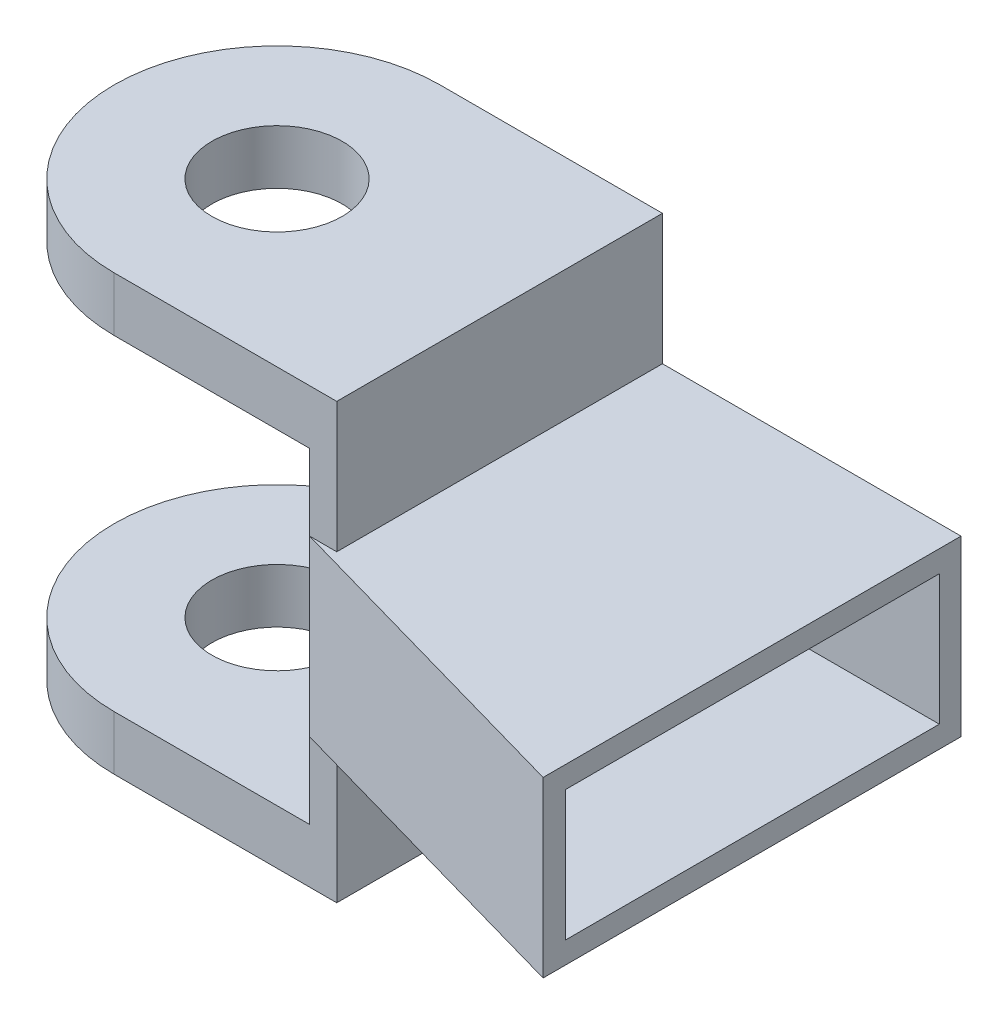
ISO-10303-21;
HEADER;
FILE_DESCRIPTION(('STEP AP214'),'2;1');
FILE_NAME('part.step','',(''),(''),'','','');
FILE_SCHEMA(('AUTOMOTIVE_DESIGN { 1 0 10303 214 1 1 1 1 }'));
ENDSEC;
DATA;
#1=APPLICATION_CONTEXT('core data for automotive mechanical design processes');
#2=APPLICATION_PROTOCOL_DEFINITION('international standard','automotive_design',2000,#1);
#3=PRODUCT_CONTEXT('',#1,'mechanical');
#4=PRODUCT('Part','Part','',(#3));
#5=PRODUCT_RELATED_PRODUCT_CATEGORY('part','',(#4));
#6=PRODUCT_DEFINITION_FORMATION('','',#4);
#7=PRODUCT_DEFINITION_CONTEXT('part definition',#1,'design');
#8=PRODUCT_DEFINITION('design','',#6,#7);
#9=PRODUCT_DEFINITION_SHAPE('','',#8);
#10=(LENGTH_UNIT() NAMED_UNIT(*) SI_UNIT(.MILLI.,.METRE.));
#11=(NAMED_UNIT(*) PLANE_ANGLE_UNIT() SI_UNIT($,.RADIAN.));
#12=(NAMED_UNIT(*) SI_UNIT($,.STERADIAN.) SOLID_ANGLE_UNIT());
#13=UNCERTAINTY_MEASURE_WITH_UNIT(LENGTH_MEASURE(1.E-05),#10,'distance_accuracy_value','');
#14=(GEOMETRIC_REPRESENTATION_CONTEXT(3) GLOBAL_UNCERTAINTY_ASSIGNED_CONTEXT((#13)) GLOBAL_UNIT_ASSIGNED_CONTEXT((#10,
#11,#12)) REPRESENTATION_CONTEXT('',''));
#15=CARTESIAN_POINT('',(0.,0.,0.));
#16=DIRECTION('',(0.,0.,1.));
#17=DIRECTION('',(1.,0.,0.));
#18=AXIS2_PLACEMENT_3D('',#15,#16,#17);
#19=CARTESIAN_POINT('',(-350.,16.,-31.0082296544966));
#20=DIRECTION('',(1.,0.,0.));
#21=DIRECTION('',(0.,0.,-1.));
#22=AXIS2_PLACEMENT_3D('',#19,#20,#21);
#23=PLANE('',#22);
#24=DIRECTION('',(0.,0.,-1.));
#25=VECTOR('',#24,1.);
#26=CARTESIAN_POINT('',(-350.,-7.,0.));
#27=LINE('',#26,#25);
#28=CARTESIAN_POINT('',(-350.,-7.,-31.0082296544966));
#29=VERTEX_POINT('',#28);
#30=CARTESIAN_POINT('',(-350.,-7.,-61.0082296544966));
#31=VERTEX_POINT('',#30);
#32=EDGE_CURVE('E170',#29,#31,#27,.T.);
#33=ORIENTED_EDGE('',*,*,#32,.F.);
#34=DIRECTION('',(0.,-1.,0.));
#35=VECTOR('',#34,1.);
#36=CARTESIAN_POINT('',(-350.,-12.,-31.0082296544966));
#37=LINE('',#36,#35);
#38=CARTESIAN_POINT('',(-350.,0.,-31.0082296544966));
#39=VERTEX_POINT('',#38);
#40=EDGE_CURVE('E184',#39,#29,#37,.T.);
#41=ORIENTED_EDGE('',*,*,#40,.F.);
#42=DIRECTION('',(0.,-1.,0.));
#43=VECTOR('',#42,1.);
#44=CARTESIAN_POINT('',(-350.,16.,-31.0082296544966));
#45=LINE('',#44,#43);
#46=CARTESIAN_POINT('',(-350.,16.,-31.0082296544966));
#47=VERTEX_POINT('',#46);
#48=EDGE_CURVE('E11',#47,#39,#45,.T.);
#49=ORIENTED_EDGE('',*,*,#48,.F.);
#50=DIRECTION('',(0.,1.,0.));
#51=VECTOR('',#50,1.);
#52=CARTESIAN_POINT('',(-350.,28.,-31.0082296544966));
#53=LINE('',#52,#51);
#54=CARTESIAN_POINT('',(-350.,23.,-31.0082296544966));
#55=VERTEX_POINT('',#54);
#56=EDGE_CURVE('E234',#47,#55,#53,.T.);
#57=ORIENTED_EDGE('',*,*,#56,.T.);
#58=DIRECTION('',(0.,0.,-1.));
#59=VECTOR('',#58,1.);
#60=CARTESIAN_POINT('',(-350.,23.,-61.0082296544966));
#61=LINE('',#60,#59);
#62=CARTESIAN_POINT('',(-350.,23.,-61.0082296544966));
#63=VERTEX_POINT('',#62);
#64=EDGE_CURVE('E216',#55,#63,#61,.T.);
#65=ORIENTED_EDGE('',*,*,#64,.T.);
#66=DIRECTION('',(0.,-1.,0.));
#67=VECTOR('',#66,1.);
#68=CARTESIAN_POINT('',(-350.,16.,-61.0082296544966));
#69=LINE('',#68,#67);
#70=EDGE_CURVE('E297',#63,#31,#69,.T.);
#71=ORIENTED_EDGE('',*,*,#70,.T.);
#72=EDGE_LOOP('',(#33,#41,#49,#57,#65,#71));
#73=FACE_BOUND('',#72,.T.);
#74=ADVANCED_FACE('F38',(#73),#23,.F.);
#75=CARTESIAN_POINT('',(-320.,16.,-61.0082296544966));
#76=DIRECTION('',(-1.,0.,0.));
#77=DIRECTION('',(0.,0.,1.));
#78=AXIS2_PLACEMENT_3D('',#75,#76,#77);
#79=PLANE('',#78);
#80=DIRECTION('',(0.,0.,-1.));
#81=VECTOR('',#80,1.);
#82=CARTESIAN_POINT('',(-320.,0.,-61.0082296544966));
#83=LINE('',#82,#81);
#84=CARTESIAN_POINT('',(-320.,0.,-22.5144026413586));
#85=VERTEX_POINT('',#84);
#86=CARTESIAN_POINT('',(-320.,0.,-61.0082296544966));
#87=VERTEX_POINT('',#86);
#88=EDGE_CURVE('E299',#85,#87,#83,.T.);
#89=ORIENTED_EDGE('',*,*,#88,.T.);
#90=DIRECTION('',(0.,-1.,0.));
#91=VECTOR('',#90,1.);
#92=CARTESIAN_POINT('',(-320.,16.,-61.0082296544966));
#93=LINE('',#92,#91);
#94=CARTESIAN_POINT('',(-320.,16.,-61.0082296544966));
#95=VERTEX_POINT('',#94);
#96=EDGE_CURVE('E304',#95,#87,#93,.T.);
#97=ORIENTED_EDGE('',*,*,#96,.F.);
#98=DIRECTION('',(0.,0.,-1.));
#99=VECTOR('',#98,1.);
#100=CARTESIAN_POINT('',(-320.,16.,-61.0082296544966));
#101=LINE('',#100,#99);
#102=CARTESIAN_POINT('',(-320.,16.,-22.5144026413586));
#103=VERTEX_POINT('',#102);
#104=EDGE_CURVE('E291',#103,#95,#101,.T.);
#105=ORIENTED_EDGE('',*,*,#104,.F.);
#106=DIRECTION('',(0.,-1.,0.));
#107=VECTOR('',#106,1.);
#108=CARTESIAN_POINT('',(-320.,16.,-22.5144026413586));
#109=LINE('',#108,#107);
#110=EDGE_CURVE('E45',#103,#85,#109,.T.);
#111=ORIENTED_EDGE('',*,*,#110,.T.);
#112=EDGE_LOOP('',(#89,#97,#105,#111));
#113=FACE_BOUND('',#112,.T.);
#114=DIRECTION('',(0.,0.,-1.));
#115=VECTOR('',#114,1.);
#116=CARTESIAN_POINT('',(-320.,2.,0.));
#117=LINE('',#116,#115);
#118=CARTESIAN_POINT('',(-320.,2.,-24.5930187379522));
#119=VERTEX_POINT('',#118);
#120=CARTESIAN_POINT('',(-320.,2.,-59.0082296544966));
#121=VERTEX_POINT('',#120);
#122=EDGE_CURVE('E276',#119,#121,#117,.T.);
#123=ORIENTED_EDGE('',*,*,#122,.F.);
#124=DIRECTION('',(0.,-1.,0.));
#125=VECTOR('',#124,1.);
#126=CARTESIAN_POINT('',(-320.,16.,-24.5930187379522));
#127=LINE('',#126,#125);
#128=CARTESIAN_POINT('',(-320.,14.,-24.5930187379522));
#129=VERTEX_POINT('',#128);
#130=EDGE_CURVE('E264',#129,#119,#127,.T.);
#131=ORIENTED_EDGE('',*,*,#130,.F.);
#132=DIRECTION('',(0.,0.,-1.));
#133=VECTOR('',#132,1.);
#134=CARTESIAN_POINT('',(-320.,14.,0.));
#135=LINE('',#134,#133);
#136=CARTESIAN_POINT('',(-320.,14.,-59.0082296544966));
#137=VERTEX_POINT('',#136);
#138=EDGE_CURVE('E279',#129,#137,#135,.T.);
#139=ORIENTED_EDGE('',*,*,#138,.T.);
#140=DIRECTION('',(0.,-1.,0.));
#141=VECTOR('',#140,1.);
#142=CARTESIAN_POINT('',(-320.,16.,-59.0082296544966));
#143=LINE('',#142,#141);
#144=EDGE_CURVE('E273',#137,#121,#143,.T.);
#145=ORIENTED_EDGE('',*,*,#144,.T.);
#146=EDGE_LOOP('',(#123,#131,#139,#145));
#147=FACE_BOUND('',#146,.T.);
#148=ADVANCED_FACE('F311',(#113,#147),#79,.F.);
#149=CARTESIAN_POINT('',(-350.,16.,-31.0082296544966));
#150=DIRECTION('',(0.272419296250593,0.,-0.962178635717054));
#151=DIRECTION('',(-0.962178635717054,0.,-0.272419296250593));
#152=AXIS2_PLACEMENT_3D('',#149,#150,#151);
#153=PLANE('',#152);
#154=DIRECTION('',(0.962178635717054,0.,0.272419296250593));
#155=VECTOR('',#154,1.);
#156=CARTESIAN_POINT('',(-350.,0.,-31.0082296544966));
#157=LINE('',#156,#155);
#158=EDGE_CURVE('E263',#39,#85,#157,.T.);
#159=ORIENTED_EDGE('',*,*,#158,.T.);
#160=ORIENTED_EDGE('',*,*,#110,.F.);
#161=DIRECTION('',(0.962178635717054,0.,0.272419296250593));
#162=VECTOR('',#161,1.);
#163=CARTESIAN_POINT('',(-350.,16.,-31.0082296544966));
#164=LINE('',#163,#162);
#165=EDGE_CURVE('E289',#47,#103,#164,.T.);
#166=ORIENTED_EDGE('',*,*,#165,.F.);
#167=ORIENTED_EDGE('',*,*,#48,.T.);
#168=EDGE_LOOP('',(#159,#160,#166,#167));
#169=FACE_BOUND('',#168,.T.);
#170=ADVANCED_FACE('F352',(#169),#153,.F.);
#171=CARTESIAN_POINT('',(-350.,16.,-61.0082296544966));
#172=DIRECTION('',(0.,0.,1.));
#173=DIRECTION('',(1.,0.,0.));
#174=AXIS2_PLACEMENT_3D('',#171,#172,#173);
#175=PLANE('',#174);
#176=DIRECTION('',(-1.,0.,0.));
#177=VECTOR('',#176,1.);
#178=CARTESIAN_POINT('',(-350.,0.,-61.0082296544966));
#179=LINE('',#178,#177);
#180=CARTESIAN_POINT('',(-347.5,0.,-61.0082296544966));
#181=VERTEX_POINT('',#180);
#182=EDGE_CURVE('E292',#87,#181,#179,.T.);
#183=ORIENTED_EDGE('',*,*,#182,.T.);
#184=DIRECTION('',(0.,1.,0.));
#185=VECTOR('',#184,1.);
#186=CARTESIAN_POINT('',(-347.5,0.,-61.0082296544966));
#187=LINE('',#186,#185);
#188=CARTESIAN_POINT('',(-347.5,-12.,-61.0082296544966));
#189=VERTEX_POINT('',#188);
#190=EDGE_CURVE('E198',#189,#181,#187,.T.);
#191=ORIENTED_EDGE('',*,*,#190,.F.);
#192=DIRECTION('',(-1.,0.,0.));
#193=VECTOR('',#192,1.);
#194=CARTESIAN_POINT('',(-347.5,-12.,-61.0082296544966));
#195=LINE('',#194,#193);
#196=CARTESIAN_POINT('',(-368.,-12.,-61.0082296544966));
#197=VERTEX_POINT('',#196);
#198=EDGE_CURVE('E205',#189,#197,#195,.T.);
#199=ORIENTED_EDGE('',*,*,#198,.T.);
#200=DIRECTION('',(0.,-1.,0.));
#201=VECTOR('',#200,1.);
#202=CARTESIAN_POINT('',(-368.,-7.,-61.0082296544966));
#203=LINE('',#202,#201);
#204=CARTESIAN_POINT('',(-368.,-7.,-61.0082296544966));
#205=VERTEX_POINT('',#204);
#206=EDGE_CURVE('E169',#205,#197,#203,.T.);
#207=ORIENTED_EDGE('',*,*,#206,.F.);
#208=DIRECTION('',(-1.,0.,0.));
#209=VECTOR('',#208,1.);
#210=CARTESIAN_POINT('',(0.,-7.,-61.0082296544966));
#211=LINE('',#210,#209);
#212=EDGE_CURVE('E177',#31,#205,#211,.T.);
#213=ORIENTED_EDGE('',*,*,#212,.F.);
#214=ORIENTED_EDGE('',*,*,#70,.F.);
#215=DIRECTION('',(-1.,0.,0.));
#216=VECTOR('',#215,1.);
#217=CARTESIAN_POINT('',(-350.,23.,-61.0082296544966));
#218=LINE('',#217,#216);
#219=CARTESIAN_POINT('',(-368.,23.,-61.0082296544966));
#220=VERTEX_POINT('',#219);
#221=EDGE_CURVE('E60',#63,#220,#218,.T.);
#222=ORIENTED_EDGE('',*,*,#221,.T.);
#223=DIRECTION('',(0.,-1.,0.));
#224=VECTOR('',#223,1.);
#225=CARTESIAN_POINT('',(-368.,28.,-61.0082296544966));
#226=LINE('',#225,#224);
#227=CARTESIAN_POINT('',(-368.,28.,-61.0082296544966));
#228=VERTEX_POINT('',#227);
#229=EDGE_CURVE('E231',#228,#220,#226,.T.);
#230=ORIENTED_EDGE('',*,*,#229,.F.);
#231=DIRECTION('',(-1.,0.,0.));
#232=VECTOR('',#231,1.);
#233=CARTESIAN_POINT('',(-347.5,28.,-61.0082296544966));
#234=LINE('',#233,#232);
#235=CARTESIAN_POINT('',(-347.5,28.,-61.0082296544966));
#236=VERTEX_POINT('',#235);
#237=EDGE_CURVE('E250',#236,#228,#234,.T.);
#238=ORIENTED_EDGE('',*,*,#237,.F.);
#239=DIRECTION('',(0.,-1.,0.));
#240=VECTOR('',#239,1.);
#241=CARTESIAN_POINT('',(-347.5,16.,-61.0082296544966));
#242=LINE('',#241,#240);
#243=CARTESIAN_POINT('',(-347.5,16.,-61.0082296544966));
#244=VERTEX_POINT('',#243);
#245=EDGE_CURVE('E244',#236,#244,#242,.T.);
#246=ORIENTED_EDGE('',*,*,#245,.T.);
#247=DIRECTION('',(-1.,0.,0.));
#248=VECTOR('',#247,1.);
#249=CARTESIAN_POINT('',(-350.,16.,-61.0082296544966));
#250=LINE('',#249,#248);
#251=EDGE_CURVE('E294',#95,#244,#250,.T.);
#252=ORIENTED_EDGE('',*,*,#251,.F.);
#253=ORIENTED_EDGE('',*,*,#96,.T.);
#254=EDGE_LOOP('',(#183,#191,#199,#207,#213,#214,#222,#230,#238,#246,#252,#253));
#255=FACE_BOUND('',#254,.T.);
#256=ADVANCED_FACE('F319',(#255),#175,.F.);
#257=CARTESIAN_POINT('',(0.,16.,0.));
#258=DIRECTION('',(0.,-1.,0.));
#259=DIRECTION('',(0.,0.,-1.));
#260=AXIS2_PLACEMENT_3D('',#257,#258,#259);
#261=PLANE('',#260);
#262=ORIENTED_EDGE('',*,*,#251,.T.);
#263=DIRECTION('',(0.,0.,1.));
#264=VECTOR('',#263,1.);
#265=CARTESIAN_POINT('',(-347.5,16.,-31.0082296544966));
#266=LINE('',#265,#264);
#267=CARTESIAN_POINT('',(-347.5,16.,-31.0082296544966));
#268=VERTEX_POINT('',#267);
#269=EDGE_CURVE('E235',#244,#268,#266,.T.);
#270=ORIENTED_EDGE('',*,*,#269,.T.);
#271=DIRECTION('',(-1.,0.,0.));
#272=VECTOR('',#271,1.);
#273=CARTESIAN_POINT('',(-347.5,16.,-31.0082296544966));
#274=LINE('',#273,#272);
#275=EDGE_CURVE('E247',#268,#47,#274,.T.);
#276=ORIENTED_EDGE('',*,*,#275,.T.);
#277=ORIENTED_EDGE('',*,*,#165,.T.);
#278=ORIENTED_EDGE('',*,*,#104,.T.);
#279=EDGE_LOOP('',(#262,#270,#276,#277,#278));
#280=FACE_BOUND('',#279,.T.);
#281=ADVANCED_FACE('F351',(#280),#261,.F.);
#282=CARTESIAN_POINT('',(0.,0.,0.));
#283=DIRECTION('',(0.,-1.,0.));
#284=DIRECTION('',(0.,0.,-1.));
#285=AXIS2_PLACEMENT_3D('',#282,#283,#284);
#286=PLANE('',#285);
#287=DIRECTION('',(-1.,0.,0.));
#288=VECTOR('',#287,1.);
#289=CARTESIAN_POINT('',(-347.5,0.,-31.0082296544966));
#290=LINE('',#289,#288);
#291=CARTESIAN_POINT('',(-347.5,0.,-31.0082296544966));
#292=VERTEX_POINT('',#291);
#293=EDGE_CURVE('E207',#292,#39,#290,.T.);
#294=ORIENTED_EDGE('',*,*,#293,.F.);
#295=DIRECTION('',(0.,0.,1.));
#296=VECTOR('',#295,1.);
#297=CARTESIAN_POINT('',(-347.5,0.,-31.0082296544966));
#298=LINE('',#297,#296);
#299=EDGE_CURVE('E52',#181,#292,#298,.T.);
#300=ORIENTED_EDGE('',*,*,#299,.F.);
#301=ORIENTED_EDGE('',*,*,#182,.F.);
#302=ORIENTED_EDGE('',*,*,#88,.F.);
#303=ORIENTED_EDGE('',*,*,#158,.F.);
#304=EDGE_LOOP('',(#294,#300,#301,#302,#303));
#305=FACE_BOUND('',#304,.T.);
#306=ADVANCED_FACE('F316',(#305),#286,.T.);
#307=CARTESIAN_POINT('',(-348.,16.,-31.0082296544966));
#308=DIRECTION('',(1.,0.,0.));
#309=DIRECTION('',(0.,0.,-1.));
#310=AXIS2_PLACEMENT_3D('',#307,#308,#309);
#311=PLANE('',#310);
#312=DIRECTION('',(0.,0.,1.));
#313=VECTOR('',#312,1.);
#314=CARTESIAN_POINT('',(-348.,2.,0.));
#315=LINE('',#314,#313);
#316=CARTESIAN_POINT('',(-348.,2.,-59.0082296544966));
#317=VERTEX_POINT('',#316);
#318=CARTESIAN_POINT('',(-348.,2.,-32.520590616881));
#319=VERTEX_POINT('',#318);
#320=EDGE_CURVE('E252',#317,#319,#315,.T.);
#321=ORIENTED_EDGE('',*,*,#320,.F.);
#322=DIRECTION('',(0.,-1.,0.));
#323=VECTOR('',#322,1.);
#324=CARTESIAN_POINT('',(-348.,16.,-59.0082296544966));
#325=LINE('',#324,#323);
#326=CARTESIAN_POINT('',(-348.,14.,-59.0082296544966));
#327=VERTEX_POINT('',#326);
#328=EDGE_CURVE('E270',#327,#317,#325,.T.);
#329=ORIENTED_EDGE('',*,*,#328,.F.);
#330=DIRECTION('',(0.,0.,1.));
#331=VECTOR('',#330,1.);
#332=CARTESIAN_POINT('',(-348.,14.,0.));
#333=LINE('',#332,#331);
#334=CARTESIAN_POINT('',(-348.,14.,-32.520590616881));
#335=VERTEX_POINT('',#334);
#336=EDGE_CURVE('E265',#327,#335,#333,.T.);
#337=ORIENTED_EDGE('',*,*,#336,.T.);
#338=DIRECTION('',(0.,-1.,0.));
#339=VECTOR('',#338,1.);
#340=CARTESIAN_POINT('',(-348.,16.,-32.520590616881));
#341=LINE('',#340,#339);
#342=EDGE_CURVE('E260',#335,#319,#341,.T.);
#343=ORIENTED_EDGE('',*,*,#342,.T.);
#344=EDGE_LOOP('',(#321,#329,#337,#343));
#345=FACE_BOUND('',#344,.T.);
#346=ADVANCED_FACE('F376',(#345),#311,.T.);
#347=CARTESIAN_POINT('',(-349.455161407499,16.,-32.9325869259307));
#348=DIRECTION('',(0.272419296250593,0.,-0.962178635717054));
#349=DIRECTION('',(-0.962178635717054,0.,-0.272419296250593));
#350=AXIS2_PLACEMENT_3D('',#347,#348,#349);
#351=PLANE('',#350);
#352=DIRECTION('',(0.962178635717054,0.,0.272419296250593));
#353=VECTOR('',#352,1.);
#354=CARTESIAN_POINT('',(-17.3017029914529,2.,61.1092136607835));
#355=LINE('',#354,#353);
#356=EDGE_CURVE('E259',#319,#119,#355,.T.);
#357=ORIENTED_EDGE('',*,*,#356,.F.);
#358=ORIENTED_EDGE('',*,*,#342,.F.);
#359=DIRECTION('',(0.962178635717054,0.,0.272419296250593));
#360=VECTOR('',#359,1.);
#361=CARTESIAN_POINT('',(-17.3017029914529,14.,61.1092136607835));
#362=LINE('',#361,#360);
#363=EDGE_CURVE('E268',#335,#129,#362,.T.);
#364=ORIENTED_EDGE('',*,*,#363,.T.);
#365=ORIENTED_EDGE('',*,*,#130,.T.);
#366=EDGE_LOOP('',(#357,#358,#364,#365));
#367=FACE_BOUND('',#366,.T.);
#368=ADVANCED_FACE('F380',(#367),#351,.T.);
#369=CARTESIAN_POINT('',(-350.,16.,-59.0082296544966));
#370=DIRECTION('',(0.,0.,1.));
#371=DIRECTION('',(1.,0.,0.));
#372=AXIS2_PLACEMENT_3D('',#369,#370,#371);
#373=PLANE('',#372);
#374=DIRECTION('',(-1.,0.,0.));
#375=VECTOR('',#374,1.);
#376=CARTESIAN_POINT('',(0.,2.,-59.0082296544966));
#377=LINE('',#376,#375);
#378=EDGE_CURVE('E269',#121,#317,#377,.T.);
#379=ORIENTED_EDGE('',*,*,#378,.F.);
#380=ORIENTED_EDGE('',*,*,#144,.F.);
#381=DIRECTION('',(-1.,0.,0.));
#382=VECTOR('',#381,1.);
#383=CARTESIAN_POINT('',(0.,14.,-59.0082296544966));
#384=LINE('',#383,#382);
#385=EDGE_CURVE('E274',#137,#327,#384,.T.);
#386=ORIENTED_EDGE('',*,*,#385,.T.);
#387=ORIENTED_EDGE('',*,*,#328,.T.);
#388=EDGE_LOOP('',(#379,#380,#386,#387));
#389=FACE_BOUND('',#388,.T.);
#390=ADVANCED_FACE('F391',(#389),#373,.T.);
#391=CARTESIAN_POINT('',(0.,14.,0.));
#392=DIRECTION('',(0.,-1.,0.));
#393=DIRECTION('',(0.,0.,-1.));
#394=AXIS2_PLACEMENT_3D('',#391,#392,#393);
#395=PLANE('',#394);
#396=ORIENTED_EDGE('',*,*,#336,.F.);
#397=ORIENTED_EDGE('',*,*,#385,.F.);
#398=ORIENTED_EDGE('',*,*,#138,.F.);
#399=ORIENTED_EDGE('',*,*,#363,.F.);
#400=EDGE_LOOP('',(#396,#397,#398,#399));
#401=FACE_BOUND('',#400,.T.);
#402=ADVANCED_FACE('F401',(#401),#395,.T.);
#403=CARTESIAN_POINT('',(0.,2.,0.));
#404=DIRECTION('',(0.,-1.,0.));
#405=DIRECTION('',(0.,0.,-1.));
#406=AXIS2_PLACEMENT_3D('',#403,#404,#405);
#407=PLANE('',#406);
#408=ORIENTED_EDGE('',*,*,#320,.T.);
#409=ORIENTED_EDGE('',*,*,#356,.T.);
#410=ORIENTED_EDGE('',*,*,#122,.T.);
#411=ORIENTED_EDGE('',*,*,#378,.T.);
#412=EDGE_LOOP('',(#408,#409,#410,#411));
#413=FACE_BOUND('',#412,.T.);
#414=ADVANCED_FACE('F411',(#413),#407,.F.);
#415=CARTESIAN_POINT('',(-347.5,28.,-61.0082296544966));
#416=DIRECTION('',(0.,1.,0.));
#417=DIRECTION('',(0.,0.,1.));
#418=AXIS2_PLACEMENT_3D('',#415,#416,#417);
#419=PLANE('',#418);
#420=ORIENTED_EDGE('',*,*,#237,.T.);
#421=CARTESIAN_POINT('',(-368.,28.,-46.0082296544966));
#422=DIRECTION('',(0.,1.,0.));
#423=DIRECTION('',(0.,0.,1.));
#424=AXIS2_PLACEMENT_3D('',#421,#422,#423);
#425=CIRCLE('',#424,15.);
#426=CARTESIAN_POINT('',(-368.,28.,-31.0082296544966));
#427=VERTEX_POINT('',#426);
#428=EDGE_CURVE('E219',#228,#427,#425,.T.);
#429=ORIENTED_EDGE('',*,*,#428,.T.);
#430=DIRECTION('',(-1.,0.,0.));
#431=VECTOR('',#430,1.);
#432=CARTESIAN_POINT('',(-347.5,28.,-31.0082296544966));
#433=LINE('',#432,#431);
#434=CARTESIAN_POINT('',(-347.5,28.,-31.0082296544966));
#435=VERTEX_POINT('',#434);
#436=EDGE_CURVE('E253',#435,#427,#433,.T.);
#437=ORIENTED_EDGE('',*,*,#436,.F.);
#438=DIRECTION('',(0.,0.,-1.));
#439=VECTOR('',#438,1.);
#440=CARTESIAN_POINT('',(-347.5,28.,-61.0082296544966));
#441=LINE('',#440,#439);
#442=EDGE_CURVE('E241',#435,#236,#441,.T.);
#443=ORIENTED_EDGE('',*,*,#442,.T.);
#444=EDGE_LOOP('',(#420,#429,#437,#443));
#445=FACE_BOUND('',#444,.T.);
#446=CARTESIAN_POINT('',(-368.,28.,-46.0082296544966));
#447=DIRECTION('',(0.,1.,0.));
#448=DIRECTION('',(0.,0.,1.));
#449=AXIS2_PLACEMENT_3D('',#446,#447,#448);
#450=CIRCLE('',#449,5.99999999999999);
#451=CARTESIAN_POINT('',(-368.,28.,-40.0082296544966));
#452=VERTEX_POINT('',#451);
#453=EDGE_CURVE('E213',#452,#452,#450,.T.);
#454=ORIENTED_EDGE('',*,*,#453,.F.);
#455=EDGE_LOOP('',(#454));
#456=FACE_BOUND('',#455,.T.);
#457=ADVANCED_FACE('F345',(#445,#456),#419,.T.);
#458=CARTESIAN_POINT('',(-347.5,28.,-31.0082296544966));
#459=DIRECTION('',(0.,0.,1.));
#460=DIRECTION('',(0.,-1.,0.));
#461=AXIS2_PLACEMENT_3D('',#458,#459,#460);
#462=PLANE('',#461);
#463=ORIENTED_EDGE('',*,*,#56,.F.);
#464=ORIENTED_EDGE('',*,*,#275,.F.);
#465=DIRECTION('',(0.,1.,0.));
#466=VECTOR('',#465,1.);
#467=CARTESIAN_POINT('',(-347.5,28.,-31.0082296544966));
#468=LINE('',#467,#466);
#469=EDGE_CURVE('E238',#268,#435,#468,.T.);
#470=ORIENTED_EDGE('',*,*,#469,.T.);
#471=ORIENTED_EDGE('',*,*,#436,.T.);
#472=DIRECTION('',(0.,-1.,0.));
#473=VECTOR('',#472,1.);
#474=CARTESIAN_POINT('',(-368.,28.,-31.0082296544966));
#475=LINE('',#474,#473);
#476=CARTESIAN_POINT('',(-368.,23.,-31.0082296544966));
#477=VERTEX_POINT('',#476);
#478=EDGE_CURVE('E222',#427,#477,#475,.T.);
#479=ORIENTED_EDGE('',*,*,#478,.T.);
#480=DIRECTION('',(1.,0.,0.));
#481=VECTOR('',#480,1.);
#482=CARTESIAN_POINT('',(-350.,23.,-31.0082296544966));
#483=LINE('',#482,#481);
#484=EDGE_CURVE('E223',#477,#55,#483,.T.);
#485=ORIENTED_EDGE('',*,*,#484,.T.);
#486=EDGE_LOOP('',(#463,#464,#470,#471,#479,#485));
#487=FACE_BOUND('',#486,.T.);
#488=ADVANCED_FACE('F336',(#487),#462,.T.);
#489=CARTESIAN_POINT('',(-347.5,0.,0.));
#490=DIRECTION('',(1.,0.,0.));
#491=DIRECTION('',(0.,0.,-1.));
#492=AXIS2_PLACEMENT_3D('',#489,#490,#491);
#493=PLANE('',#492);
#494=ORIENTED_EDGE('',*,*,#269,.F.);
#495=ORIENTED_EDGE('',*,*,#245,.F.);
#496=ORIENTED_EDGE('',*,*,#442,.F.);
#497=ORIENTED_EDGE('',*,*,#469,.F.);
#498=EDGE_LOOP('',(#494,#495,#496,#497));
#499=FACE_BOUND('',#498,.T.);
#500=ADVANCED_FACE('F349',(#499),#493,.T.);
#501=CARTESIAN_POINT('',(-368.,23.,-46.0082296544966));
#502=DIRECTION('',(0.,1.,0.));
#503=DIRECTION('',(0.,0.,1.));
#504=AXIS2_PLACEMENT_3D('',#501,#502,#503);
#505=PLANE('',#504);
#506=ORIENTED_EDGE('',*,*,#64,.F.);
#507=ORIENTED_EDGE('',*,*,#484,.F.);
#508=CARTESIAN_POINT('',(-368.,23.,-46.0082296544966));
#509=DIRECTION('',(0.,1.,0.));
#510=DIRECTION('',(0.,0.,1.));
#511=AXIS2_PLACEMENT_3D('',#508,#509,#510);
#512=CIRCLE('',#511,15.);
#513=EDGE_CURVE('E226',#220,#477,#512,.T.);
#514=ORIENTED_EDGE('',*,*,#513,.F.);
#515=ORIENTED_EDGE('',*,*,#221,.F.);
#516=EDGE_LOOP('',(#506,#507,#514,#515));
#517=FACE_BOUND('',#516,.T.);
#518=CARTESIAN_POINT('',(-368.,23.,-46.0082296544966));
#519=DIRECTION('',(0.,1.,0.));
#520=DIRECTION('',(0.,0.,1.));
#521=AXIS2_PLACEMENT_3D('',#518,#519,#520);
#522=CIRCLE('',#521,5.99999999999999);
#523=CARTESIAN_POINT('',(-368.,23.,-40.0082296544966));
#524=VERTEX_POINT('',#523);
#525=EDGE_CURVE('E209',#524,#524,#522,.T.);
#526=ORIENTED_EDGE('',*,*,#525,.T.);
#527=EDGE_LOOP('',(#526));
#528=FACE_BOUND('',#527,.T.);
#529=ADVANCED_FACE('F333',(#517,#528),#505,.F.);
#530=CARTESIAN_POINT('',(-368.,28.,-46.0082296544966));
#531=DIRECTION('',(0.,-1.,0.));
#532=DIRECTION('',(0.,0.,-1.));
#533=AXIS2_PLACEMENT_3D('',#530,#531,#532);
#534=CYLINDRICAL_SURFACE('',#533,15.);
#535=ORIENTED_EDGE('',*,*,#513,.T.);
#536=ORIENTED_EDGE('',*,*,#478,.F.);
#537=ORIENTED_EDGE('',*,*,#428,.F.);
#538=ORIENTED_EDGE('',*,*,#229,.T.);
#539=EDGE_LOOP('',(#535,#536,#537,#538));
#540=FACE_BOUND('',#539,.T.);
#541=ADVANCED_FACE('F340',(#540),#534,.T.);
#542=CARTESIAN_POINT('',(-368.,28.,-46.0082296544966));
#543=DIRECTION('',(0.,-1.,0.));
#544=DIRECTION('',(0.,0.,-1.));
#545=AXIS2_PLACEMENT_3D('',#542,#543,#544);
#546=CYLINDRICAL_SURFACE('',#545,5.99999999999999);
#547=ORIENTED_EDGE('',*,*,#453,.T.);
#548=EDGE_LOOP('',(#547));
#549=FACE_BOUND('',#548,.T.);
#550=ORIENTED_EDGE('',*,*,#525,.F.);
#551=EDGE_LOOP('',(#550));
#552=FACE_BOUND('',#551,.T.);
#553=ADVANCED_FACE('F475',(#549,#552),#546,.F.);
#554=CARTESIAN_POINT('',(-347.5,-12.,-31.0082296544966));
#555=DIRECTION('',(0.,0.,-1.));
#556=DIRECTION('',(0.,1.,0.));
#557=AXIS2_PLACEMENT_3D('',#554,#555,#556);
#558=PLANE('',#557);
#559=ORIENTED_EDGE('',*,*,#40,.T.);
#560=DIRECTION('',(-1.,0.,0.));
#561=VECTOR('',#560,1.);
#562=CARTESIAN_POINT('',(0.,-7.,-31.0082296544966));
#563=LINE('',#562,#561);
#564=CARTESIAN_POINT('',(-368.,-7.,-31.0082296544966));
#565=VERTEX_POINT('',#564);
#566=EDGE_CURVE('E175',#29,#565,#563,.T.);
#567=ORIENTED_EDGE('',*,*,#566,.T.);
#568=DIRECTION('',(0.,-1.,0.));
#569=VECTOR('',#568,1.);
#570=CARTESIAN_POINT('',(-368.,-7.,-31.0082296544966));
#571=LINE('',#570,#569);
#572=CARTESIAN_POINT('',(-368.,-12.,-31.0082296544966));
#573=VERTEX_POINT('',#572);
#574=EDGE_CURVE('E159',#565,#573,#571,.T.);
#575=ORIENTED_EDGE('',*,*,#574,.T.);
#576=DIRECTION('',(-1.,0.,0.));
#577=VECTOR('',#576,1.);
#578=CARTESIAN_POINT('',(-347.5,-12.,-31.0082296544966));
#579=LINE('',#578,#577);
#580=CARTESIAN_POINT('',(-347.5,-12.,-31.0082296544966));
#581=VERTEX_POINT('',#580);
#582=EDGE_CURVE('E210',#581,#573,#579,.T.);
#583=ORIENTED_EDGE('',*,*,#582,.F.);
#584=DIRECTION('',(0.,-1.,0.));
#585=VECTOR('',#584,1.);
#586=CARTESIAN_POINT('',(-347.5,-12.,-31.0082296544966));
#587=LINE('',#586,#585);
#588=EDGE_CURVE('E203',#292,#581,#587,.T.);
#589=ORIENTED_EDGE('',*,*,#588,.F.);
#590=ORIENTED_EDGE('',*,*,#293,.T.);
#591=EDGE_LOOP('',(#559,#567,#575,#583,#589,#590));
#592=FACE_BOUND('',#591,.T.);
#593=ADVANCED_FACE('F181',(#592),#558,.F.);
#594=CARTESIAN_POINT('',(-347.5,-12.,-61.0082296544966));
#595=DIRECTION('',(0.,1.,0.));
#596=DIRECTION('',(0.,0.,1.));
#597=AXIS2_PLACEMENT_3D('',#594,#595,#596);
#598=PLANE('',#597);
#599=ORIENTED_EDGE('',*,*,#582,.T.);
#600=CARTESIAN_POINT('',(-368.,-12.,-46.0082296544966));
#601=DIRECTION('',(0.,-1.,0.));
#602=DIRECTION('',(0.,0.,-1.));
#603=AXIS2_PLACEMENT_3D('',#600,#601,#602);
#604=CIRCLE('',#603,15.);
#605=EDGE_CURVE('E165',#573,#197,#604,.T.);
#606=ORIENTED_EDGE('',*,*,#605,.T.);
#607=ORIENTED_EDGE('',*,*,#198,.F.);
#608=DIRECTION('',(0.,0.,-1.));
#609=VECTOR('',#608,1.);
#610=CARTESIAN_POINT('',(-347.5,-12.,-61.0082296544966));
#611=LINE('',#610,#609);
#612=EDGE_CURVE('E201',#581,#189,#611,.T.);
#613=ORIENTED_EDGE('',*,*,#612,.F.);
#614=EDGE_LOOP('',(#599,#606,#607,#613));
#615=FACE_BOUND('',#614,.T.);
#616=CARTESIAN_POINT('',(-368.,-12.,-46.0082296544966));
#617=DIRECTION('',(0.,-1.,0.));
#618=DIRECTION('',(0.,0.,-1.));
#619=AXIS2_PLACEMENT_3D('',#616,#617,#618);
#620=CIRCLE('',#619,5.99999999999999);
#621=CARTESIAN_POINT('',(-368.,-12.,-52.0082296544966));
#622=VERTEX_POINT('',#621);
#623=EDGE_CURVE('E192',#622,#622,#620,.T.);
#624=ORIENTED_EDGE('',*,*,#623,.F.);
#625=EDGE_LOOP('',(#624));
#626=FACE_BOUND('',#625,.T.);
#627=ADVANCED_FACE('F327',(#615,#626),#598,.F.);
#628=CARTESIAN_POINT('',(-347.5,16.,0.));
#629=DIRECTION('',(1.,0.,0.));
#630=DIRECTION('',(0.,0.,-1.));
#631=AXIS2_PLACEMENT_3D('',#628,#629,#630);
#632=PLANE('',#631);
#633=ORIENTED_EDGE('',*,*,#299,.T.);
#634=ORIENTED_EDGE('',*,*,#588,.T.);
#635=ORIENTED_EDGE('',*,*,#612,.T.);
#636=ORIENTED_EDGE('',*,*,#190,.T.);
#637=EDGE_LOOP('',(#633,#634,#635,#636));
#638=FACE_BOUND('',#637,.T.);
#639=ADVANCED_FACE('F322',(#638),#632,.T.);
#640=CARTESIAN_POINT('',(-368.,-7.,-46.0082296544966));
#641=DIRECTION('',(0.,-1.,0.));
#642=DIRECTION('',(0.,0.,-1.));
#643=AXIS2_PLACEMENT_3D('',#640,#641,#642);
#644=CYLINDRICAL_SURFACE('',#643,5.99999999999999);
#645=CARTESIAN_POINT('',(-368.,-7.,-46.0082296544966));
#646=DIRECTION('',(0.,-1.,0.));
#647=DIRECTION('',(0.,0.,-1.));
#648=AXIS2_PLACEMENT_3D('',#645,#646,#647);
#649=CIRCLE('',#648,5.99999999999999);
#650=CARTESIAN_POINT('',(-368.,-7.,-52.0082296544966));
#651=VERTEX_POINT('',#650);
#652=EDGE_CURVE('E185',#651,#651,#649,.T.);
#653=ORIENTED_EDGE('',*,*,#652,.F.);
#654=EDGE_LOOP('',(#653));
#655=FACE_BOUND('',#654,.T.);
#656=ORIENTED_EDGE('',*,*,#623,.T.);
#657=EDGE_LOOP('',(#656));
#658=FACE_BOUND('',#657,.T.);
#659=ADVANCED_FACE('F503',(#655,#658),#644,.F.);
#660=CARTESIAN_POINT('',(-368.,-7.,-46.0082296544966));
#661=DIRECTION('',(0.,-1.,0.));
#662=DIRECTION('',(0.,0.,-1.));
#663=AXIS2_PLACEMENT_3D('',#660,#661,#662);
#664=CYLINDRICAL_SURFACE('',#663,15.);
#665=ORIENTED_EDGE('',*,*,#605,.F.);
#666=ORIENTED_EDGE('',*,*,#574,.F.);
#667=CARTESIAN_POINT('',(-368.,-7.,-46.0082296544966));
#668=DIRECTION('',(0.,-1.,0.));
#669=DIRECTION('',(0.,0.,-1.));
#670=AXIS2_PLACEMENT_3D('',#667,#668,#669);
#671=CIRCLE('',#670,15.);
#672=EDGE_CURVE('E163',#565,#205,#671,.T.);
#673=ORIENTED_EDGE('',*,*,#672,.T.);
#674=ORIENTED_EDGE('',*,*,#206,.T.);
#675=EDGE_LOOP('',(#665,#666,#673,#674));
#676=FACE_BOUND('',#675,.T.);
#677=ADVANCED_FACE('F161',(#676),#664,.T.);
#678=CARTESIAN_POINT('',(0.,-7.,0.));
#679=DIRECTION('',(0.,-1.,0.));
#680=DIRECTION('',(0.,0.,-1.));
#681=AXIS2_PLACEMENT_3D('',#678,#679,#680);
#682=PLANE('',#681);
#683=ORIENTED_EDGE('',*,*,#652,.T.);
#684=EDGE_LOOP('',(#683));
#685=FACE_BOUND('',#684,.T.);
#686=ORIENTED_EDGE('',*,*,#566,.F.);
#687=ORIENTED_EDGE('',*,*,#32,.T.);
#688=ORIENTED_EDGE('',*,*,#212,.T.);
#689=ORIENTED_EDGE('',*,*,#672,.F.);
#690=EDGE_LOOP('',(#686,#687,#688,#689));
#691=FACE_BOUND('',#690,.T.);
#692=ADVANCED_FACE('F173',(#685,#691),#682,.F.);
#693=CLOSED_SHELL('',(#74,#148,#170,#256,#281,#306,#346,#368,#390,#402,#414,#457,#488,#500,#529,
#541,#553,#593,#627,#639,#659,#677,#692));
#694=MANIFOLD_SOLID_BREP('B2',#693);
#695=ADVANCED_BREP_SHAPE_REPRESENTATION('',(#18,#694),#14);
#696=SHAPE_DEFINITION_REPRESENTATION(#9,#695);
ENDSEC;
END-ISO-10303-21;
